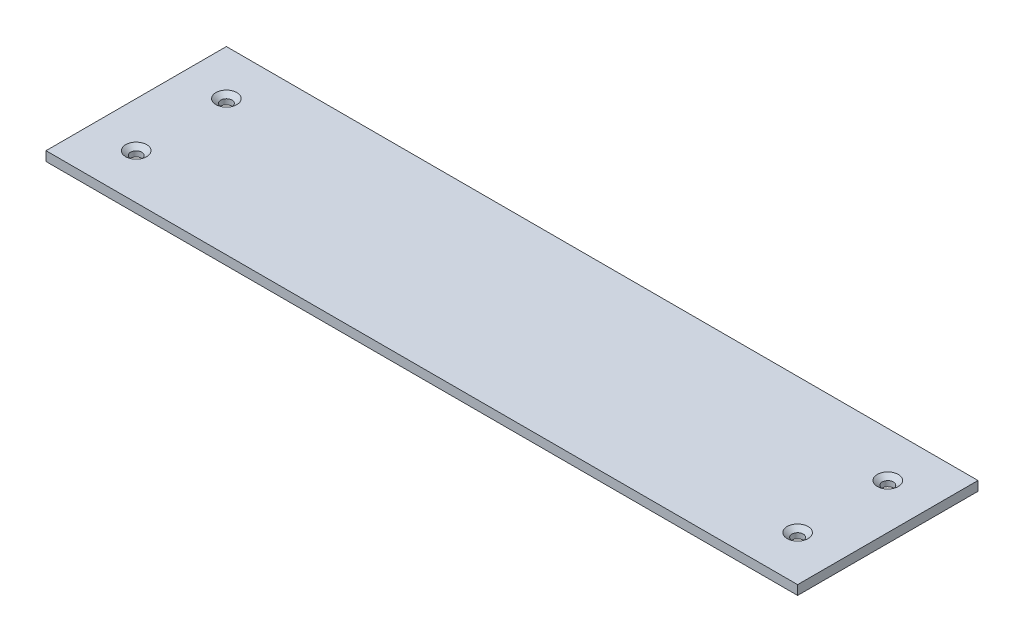
ISO-10303-21;
HEADER;
FILE_DESCRIPTION(('STEP AP214'),'2;1');
FILE_NAME('part.step','',(''),(''),'','','');
FILE_SCHEMA(('AUTOMOTIVE_DESIGN { 1 0 10303 214 1 1 1 1 }'));
ENDSEC;
DATA;
#1=APPLICATION_CONTEXT('core data for automotive mechanical design processes');
#2=APPLICATION_PROTOCOL_DEFINITION('international standard','automotive_design',2000,#1);
#3=PRODUCT_CONTEXT('',#1,'mechanical');
#4=PRODUCT('Part','Part','',(#3));
#5=PRODUCT_RELATED_PRODUCT_CATEGORY('part','',(#4));
#6=PRODUCT_DEFINITION_FORMATION('','',#4);
#7=PRODUCT_DEFINITION_CONTEXT('part definition',#1,'design');
#8=PRODUCT_DEFINITION('design','',#6,#7);
#9=PRODUCT_DEFINITION_SHAPE('','',#8);
#10=(LENGTH_UNIT() NAMED_UNIT(*) SI_UNIT(.MILLI.,.METRE.));
#11=(NAMED_UNIT(*) PLANE_ANGLE_UNIT() SI_UNIT($,.RADIAN.));
#12=(NAMED_UNIT(*) SI_UNIT($,.STERADIAN.) SOLID_ANGLE_UNIT());
#13=UNCERTAINTY_MEASURE_WITH_UNIT(LENGTH_MEASURE(1.E-05),#10,'distance_accuracy_value','');
#14=(GEOMETRIC_REPRESENTATION_CONTEXT(3) GLOBAL_UNCERTAINTY_ASSIGNED_CONTEXT((#13)) GLOBAL_UNIT_ASSIGNED_CONTEXT((#10,
#11,#12)) REPRESENTATION_CONTEXT('',''));
#15=CARTESIAN_POINT('',(0.,0.,0.));
#16=DIRECTION('',(0.,0.,1.));
#17=DIRECTION('',(1.,0.,0.));
#18=AXIS2_PLACEMENT_3D('',#15,#16,#17);
#19=CARTESIAN_POINT('',(0.,3.175,0.));
#20=DIRECTION('',(1.,0.,0.));
#21=DIRECTION('',(0.,0.,-1.));
#22=AXIS2_PLACEMENT_3D('',#19,#20,#21);
#23=PLANE('',#22);
#24=DIRECTION('',(0.,0.,1.));
#25=VECTOR('',#24,1.);
#26=CARTESIAN_POINT('',(0.,0.,0.));
#27=LINE('',#26,#25);
#28=CARTESIAN_POINT('',(0.,0.,-60.96));
#29=VERTEX_POINT('',#28);
#30=CARTESIAN_POINT('',(0.,0.,0.));
#31=VERTEX_POINT('',#30);
#32=EDGE_CURVE('E111',#29,#31,#27,.T.);
#33=ORIENTED_EDGE('',*,*,#32,.T.);
#34=DIRECTION('',(0.,-1.,0.));
#35=VECTOR('',#34,1.);
#36=CARTESIAN_POINT('',(0.,3.175,0.));
#37=LINE('',#36,#35);
#38=CARTESIAN_POINT('',(0.,3.175,0.));
#39=VERTEX_POINT('',#38);
#40=EDGE_CURVE('E11',#39,#31,#37,.T.);
#41=ORIENTED_EDGE('',*,*,#40,.F.);
#42=DIRECTION('',(0.,0.,1.));
#43=VECTOR('',#42,1.);
#44=CARTESIAN_POINT('',(0.,3.175,0.));
#45=LINE('',#44,#43);
#46=CARTESIAN_POINT('',(0.,3.175,-60.96));
#47=VERTEX_POINT('',#46);
#48=EDGE_CURVE('E95',#47,#39,#45,.T.);
#49=ORIENTED_EDGE('',*,*,#48,.F.);
#50=DIRECTION('',(0.,-1.,0.));
#51=VECTOR('',#50,1.);
#52=CARTESIAN_POINT('',(0.,3.175,-60.96));
#53=LINE('',#52,#51);
#54=EDGE_CURVE('E107',#47,#29,#53,.T.);
#55=ORIENTED_EDGE('',*,*,#54,.T.);
#56=EDGE_LOOP('',(#33,#41,#49,#55));
#57=FACE_BOUND('',#56,.T.);
#58=ADVANCED_FACE('F43',(#57),#23,.F.);
#59=CARTESIAN_POINT('',(0.,3.175,0.));
#60=DIRECTION('',(0.,0.,-1.));
#61=DIRECTION('',(-1.,0.,0.));
#62=AXIS2_PLACEMENT_3D('',#59,#60,#61);
#63=PLANE('',#62);
#64=DIRECTION('',(1.,0.,0.));
#65=VECTOR('',#64,1.);
#66=CARTESIAN_POINT('',(0.,0.,0.));
#67=LINE('',#66,#65);
#68=CARTESIAN_POINT('',(254.,0.,0.));
#69=VERTEX_POINT('',#68);
#70=EDGE_CURVE('E100',#31,#69,#67,.T.);
#71=ORIENTED_EDGE('',*,*,#70,.T.);
#72=DIRECTION('',(0.,-1.,0.));
#73=VECTOR('',#72,1.);
#74=CARTESIAN_POINT('',(254.,3.175,0.));
#75=LINE('',#74,#73);
#76=CARTESIAN_POINT('',(254.,3.175,0.));
#77=VERTEX_POINT('',#76);
#78=EDGE_CURVE('E52',#77,#69,#75,.T.);
#79=ORIENTED_EDGE('',*,*,#78,.F.);
#80=DIRECTION('',(1.,0.,0.));
#81=VECTOR('',#80,1.);
#82=CARTESIAN_POINT('',(0.,3.175,0.));
#83=LINE('',#82,#81);
#84=EDGE_CURVE('E90',#39,#77,#83,.T.);
#85=ORIENTED_EDGE('',*,*,#84,.F.);
#86=ORIENTED_EDGE('',*,*,#40,.T.);
#87=EDGE_LOOP('',(#71,#79,#85,#86));
#88=FACE_BOUND('',#87,.T.);
#89=ADVANCED_FACE('F99',(#88),#63,.F.);
#90=CARTESIAN_POINT('',(254.,3.175,0.));
#91=DIRECTION('',(-1.,0.,0.));
#92=DIRECTION('',(0.,0.,1.));
#93=AXIS2_PLACEMENT_3D('',#90,#91,#92);
#94=PLANE('',#93);
#95=DIRECTION('',(0.,0.,-1.));
#96=VECTOR('',#95,1.);
#97=CARTESIAN_POINT('',(254.,0.,0.));
#98=LINE('',#97,#96);
#99=CARTESIAN_POINT('',(254.,0.,-60.96));
#100=VERTEX_POINT('',#99);
#101=EDGE_CURVE('E77',#69,#100,#98,.T.);
#102=ORIENTED_EDGE('',*,*,#101,.T.);
#103=DIRECTION('',(0.,-1.,0.));
#104=VECTOR('',#103,1.);
#105=CARTESIAN_POINT('',(254.,3.175,-60.96));
#106=LINE('',#105,#104);
#107=CARTESIAN_POINT('',(254.,3.175,-60.96));
#108=VERTEX_POINT('',#107);
#109=EDGE_CURVE('E102',#108,#100,#106,.T.);
#110=ORIENTED_EDGE('',*,*,#109,.F.);
#111=DIRECTION('',(0.,0.,-1.));
#112=VECTOR('',#111,1.);
#113=CARTESIAN_POINT('',(254.,3.175,0.));
#114=LINE('',#113,#112);
#115=EDGE_CURVE('E93',#77,#108,#114,.T.);
#116=ORIENTED_EDGE('',*,*,#115,.F.);
#117=ORIENTED_EDGE('',*,*,#78,.T.);
#118=EDGE_LOOP('',(#102,#110,#116,#117));
#119=FACE_BOUND('',#118,.T.);
#120=ADVANCED_FACE('F103',(#119),#94,.F.);
#121=CARTESIAN_POINT('',(0.,3.175,-60.96));
#122=DIRECTION('',(0.,0.,1.));
#123=DIRECTION('',(1.,0.,0.));
#124=AXIS2_PLACEMENT_3D('',#121,#122,#123);
#125=PLANE('',#124);
#126=DIRECTION('',(-1.,0.,0.));
#127=VECTOR('',#126,1.);
#128=CARTESIAN_POINT('',(0.,0.,-60.96));
#129=LINE('',#128,#127);
#130=EDGE_CURVE('E83',#100,#29,#129,.T.);
#131=ORIENTED_EDGE('',*,*,#130,.T.);
#132=ORIENTED_EDGE('',*,*,#54,.F.);
#133=DIRECTION('',(-1.,0.,0.));
#134=VECTOR('',#133,1.);
#135=CARTESIAN_POINT('',(0.,3.175,-60.96));
#136=LINE('',#135,#134);
#137=EDGE_CURVE('E60',#108,#47,#136,.T.);
#138=ORIENTED_EDGE('',*,*,#137,.F.);
#139=ORIENTED_EDGE('',*,*,#109,.T.);
#140=EDGE_LOOP('',(#131,#132,#138,#139));
#141=FACE_BOUND('',#140,.T.);
#142=ADVANCED_FACE('F125',(#141),#125,.F.);
#143=CARTESIAN_POINT('',(0.,3.175,0.));
#144=DIRECTION('',(0.,-1.,0.));
#145=DIRECTION('',(0.,0.,-1.));
#146=AXIS2_PLACEMENT_3D('',#143,#144,#145);
#147=PLANE('',#146);
#148=CARTESIAN_POINT('',(15.24,3.175,-15.24));
#149=DIRECTION('',(0.,1.,0.));
#150=DIRECTION('',(0.,0.,1.));
#151=AXIS2_PLACEMENT_3D('',#148,#149,#150);
#152=CIRCLE('',#151,3.5433);
#153=CARTESIAN_POINT('',(15.24,3.175,-11.6967));
#154=VERTEX_POINT('',#153);
#155=EDGE_CURVE('E175',#154,#154,#152,.T.);
#156=ORIENTED_EDGE('',*,*,#155,.F.);
#157=EDGE_LOOP('',(#156));
#158=FACE_BOUND('',#157,.T.);
#159=CARTESIAN_POINT('',(15.24,3.175,-45.72));
#160=DIRECTION('',(0.,1.,0.));
#161=DIRECTION('',(0.,0.,1.));
#162=AXIS2_PLACEMENT_3D('',#159,#160,#161);
#163=CIRCLE('',#162,3.5433);
#164=CARTESIAN_POINT('',(15.24,3.175,-42.1767));
#165=VERTEX_POINT('',#164);
#166=EDGE_CURVE('E163',#165,#165,#163,.T.);
#167=ORIENTED_EDGE('',*,*,#166,.F.);
#168=EDGE_LOOP('',(#167));
#169=FACE_BOUND('',#168,.T.);
#170=CARTESIAN_POINT('',(238.76,3.175,-15.24));
#171=DIRECTION('',(0.,1.,0.));
#172=DIRECTION('',(0.,0.,1.));
#173=AXIS2_PLACEMENT_3D('',#170,#171,#172);
#174=CIRCLE('',#173,3.5433);
#175=CARTESIAN_POINT('',(238.76,3.175,-11.6967));
#176=VERTEX_POINT('',#175);
#177=EDGE_CURVE('E151',#176,#176,#174,.T.);
#178=ORIENTED_EDGE('',*,*,#177,.F.);
#179=EDGE_LOOP('',(#178));
#180=FACE_BOUND('',#179,.T.);
#181=CARTESIAN_POINT('',(238.76,3.175,-45.72));
#182=DIRECTION('',(0.,1.,0.));
#183=DIRECTION('',(0.,0.,1.));
#184=AXIS2_PLACEMENT_3D('',#181,#182,#183);
#185=CIRCLE('',#184,3.5433);
#186=CARTESIAN_POINT('',(238.76,3.175,-42.1767));
#187=VERTEX_POINT('',#186);
#188=EDGE_CURVE('E139',#187,#187,#185,.T.);
#189=ORIENTED_EDGE('',*,*,#188,.F.);
#190=EDGE_LOOP('',(#189));
#191=FACE_BOUND('',#190,.T.);
#192=ORIENTED_EDGE('',*,*,#48,.T.);
#193=ORIENTED_EDGE('',*,*,#84,.T.);
#194=ORIENTED_EDGE('',*,*,#115,.T.);
#195=ORIENTED_EDGE('',*,*,#137,.T.);
#196=EDGE_LOOP('',(#192,#193,#194,#195));
#197=FACE_BOUND('',#196,.T.);
#198=ADVANCED_FACE('F91',(#158,#169,#180,#191,#197),#147,.F.);
#199=CARTESIAN_POINT('',(0.,0.,0.));
#200=DIRECTION('',(0.,-1.,0.));
#201=DIRECTION('',(0.,0.,-1.));
#202=AXIS2_PLACEMENT_3D('',#199,#200,#201);
#203=PLANE('',#202);
#204=CARTESIAN_POINT('',(15.24,0.,-15.24));
#205=DIRECTION('',(0.,1.,0.));
#206=DIRECTION('',(0.,0.,1.));
#207=AXIS2_PLACEMENT_3D('',#204,#205,#206);
#208=CIRCLE('',#207,1.89865);
#209=CARTESIAN_POINT('',(15.24,0.,-13.34135));
#210=VERTEX_POINT('',#209);
#211=EDGE_CURVE('E167',#210,#210,#208,.T.);
#212=ORIENTED_EDGE('',*,*,#211,.T.);
#213=EDGE_LOOP('',(#212));
#214=FACE_BOUND('',#213,.T.);
#215=CARTESIAN_POINT('',(15.24,0.,-45.72));
#216=DIRECTION('',(0.,1.,0.));
#217=DIRECTION('',(0.,0.,1.));
#218=AXIS2_PLACEMENT_3D('',#215,#216,#217);
#219=CIRCLE('',#218,1.89865);
#220=CARTESIAN_POINT('',(15.24,0.,-43.82135));
#221=VERTEX_POINT('',#220);
#222=EDGE_CURVE('E155',#221,#221,#219,.T.);
#223=ORIENTED_EDGE('',*,*,#222,.T.);
#224=EDGE_LOOP('',(#223));
#225=FACE_BOUND('',#224,.T.);
#226=CARTESIAN_POINT('',(238.76,0.,-15.24));
#227=DIRECTION('',(0.,1.,0.));
#228=DIRECTION('',(0.,0.,1.));
#229=AXIS2_PLACEMENT_3D('',#226,#227,#228);
#230=CIRCLE('',#229,1.89865);
#231=CARTESIAN_POINT('',(238.76,0.,-13.34135));
#232=VERTEX_POINT('',#231);
#233=EDGE_CURVE('E143',#232,#232,#230,.T.);
#234=ORIENTED_EDGE('',*,*,#233,.T.);
#235=EDGE_LOOP('',(#234));
#236=FACE_BOUND('',#235,.T.);
#237=CARTESIAN_POINT('',(238.76,0.,-45.72));
#238=DIRECTION('',(0.,1.,0.));
#239=DIRECTION('',(0.,0.,1.));
#240=AXIS2_PLACEMENT_3D('',#237,#238,#239);
#241=CIRCLE('',#240,1.89865);
#242=CARTESIAN_POINT('',(238.76,0.,-43.82135));
#243=VERTEX_POINT('',#242);
#244=EDGE_CURVE('E115',#243,#243,#241,.T.);
#245=ORIENTED_EDGE('',*,*,#244,.T.);
#246=EDGE_LOOP('',(#245));
#247=FACE_BOUND('',#246,.T.);
#248=ORIENTED_EDGE('',*,*,#32,.F.);
#249=ORIENTED_EDGE('',*,*,#130,.F.);
#250=ORIENTED_EDGE('',*,*,#101,.F.);
#251=ORIENTED_EDGE('',*,*,#70,.F.);
#252=EDGE_LOOP('',(#248,#249,#250,#251));
#253=FACE_BOUND('',#252,.T.);
#254=ADVANCED_FACE('F128',(#214,#225,#236,#247,#253),#203,.T.);
#255=CARTESIAN_POINT('',(238.76,3.175,-45.72));
#256=DIRECTION('',(0.,1.,0.));
#257=DIRECTION('',(0.,0.,1.));
#258=AXIS2_PLACEMENT_3D('',#255,#256,#257);
#259=CYLINDRICAL_SURFACE('',#258,1.89865);
#260=ORIENTED_EDGE('',*,*,#244,.F.);
#261=EDGE_LOOP('',(#260));
#262=FACE_BOUND('',#261,.T.);
#263=CARTESIAN_POINT('',(238.76,1.79497479158429,-45.72));
#264=DIRECTION('',(0.,1.,0.));
#265=DIRECTION('',(0.,0.,1.));
#266=AXIS2_PLACEMENT_3D('',#263,#264,#265);
#267=CIRCLE('',#266,1.89865);
#268=CARTESIAN_POINT('',(238.76,1.79497479158429,-43.82135));
#269=VERTEX_POINT('',#268);
#270=EDGE_CURVE('E135',#269,#269,#267,.T.);
#271=ORIENTED_EDGE('',*,*,#270,.T.);
#272=EDGE_LOOP('',(#271));
#273=FACE_BOUND('',#272,.T.);
#274=ADVANCED_FACE('F194',(#262,#273),#259,.F.);
#275=CARTESIAN_POINT('',(238.76,3.175,-45.72));
#276=DIRECTION('',(0.,1.,0.));
#277=DIRECTION('',(0.,0.,1.));
#278=AXIS2_PLACEMENT_3D('',#275,#276,#277);
#279=CONICAL_SURFACE('',#278,3.5433,0.872664625997164);
#280=ORIENTED_EDGE('',*,*,#270,.F.);
#281=EDGE_LOOP('',(#280));
#282=FACE_BOUND('',#281,.T.);
#283=ORIENTED_EDGE('',*,*,#188,.T.);
#284=EDGE_LOOP('',(#283));
#285=FACE_BOUND('',#284,.T.);
#286=ADVANCED_FACE('F191',(#282,#285),#279,.F.);
#287=CARTESIAN_POINT('',(238.76,3.175,-15.24));
#288=DIRECTION('',(0.,1.,0.));
#289=DIRECTION('',(0.,0.,1.));
#290=AXIS2_PLACEMENT_3D('',#287,#288,#289);
#291=CYLINDRICAL_SURFACE('',#290,1.89865);
#292=ORIENTED_EDGE('',*,*,#233,.F.);
#293=EDGE_LOOP('',(#292));
#294=FACE_BOUND('',#293,.T.);
#295=CARTESIAN_POINT('',(238.76,1.79497479158429,-15.24));
#296=DIRECTION('',(0.,1.,0.));
#297=DIRECTION('',(0.,0.,1.));
#298=AXIS2_PLACEMENT_3D('',#295,#296,#297);
#299=CIRCLE('',#298,1.89865);
#300=CARTESIAN_POINT('',(238.76,1.79497479158429,-13.34135));
#301=VERTEX_POINT('',#300);
#302=EDGE_CURVE('E147',#301,#301,#299,.T.);
#303=ORIENTED_EDGE('',*,*,#302,.T.);
#304=EDGE_LOOP('',(#303));
#305=FACE_BOUND('',#304,.T.);
#306=ADVANCED_FACE('F193',(#294,#305),#291,.F.);
#307=CARTESIAN_POINT('',(238.76,3.175,-15.24));
#308=DIRECTION('',(0.,1.,0.));
#309=DIRECTION('',(0.,0.,1.));
#310=AXIS2_PLACEMENT_3D('',#307,#308,#309);
#311=CONICAL_SURFACE('',#310,3.5433,0.872664625997164);
#312=ORIENTED_EDGE('',*,*,#302,.F.);
#313=EDGE_LOOP('',(#312));
#314=FACE_BOUND('',#313,.T.);
#315=ORIENTED_EDGE('',*,*,#177,.T.);
#316=EDGE_LOOP('',(#315));
#317=FACE_BOUND('',#316,.T.);
#318=ADVANCED_FACE('F201',(#314,#317),#311,.F.);
#319=CARTESIAN_POINT('',(15.24,3.175,-45.72));
#320=DIRECTION('',(0.,1.,0.));
#321=DIRECTION('',(0.,0.,1.));
#322=AXIS2_PLACEMENT_3D('',#319,#320,#321);
#323=CYLINDRICAL_SURFACE('',#322,1.89865);
#324=ORIENTED_EDGE('',*,*,#222,.F.);
#325=EDGE_LOOP('',(#324));
#326=FACE_BOUND('',#325,.T.);
#327=CARTESIAN_POINT('',(15.24,1.79497479158429,-45.72));
#328=DIRECTION('',(0.,1.,0.));
#329=DIRECTION('',(0.,0.,1.));
#330=AXIS2_PLACEMENT_3D('',#327,#328,#329);
#331=CIRCLE('',#330,1.89865);
#332=CARTESIAN_POINT('',(15.24,1.79497479158429,-43.82135));
#333=VERTEX_POINT('',#332);
#334=EDGE_CURVE('E159',#333,#333,#331,.T.);
#335=ORIENTED_EDGE('',*,*,#334,.T.);
#336=EDGE_LOOP('',(#335));
#337=FACE_BOUND('',#336,.T.);
#338=ADVANCED_FACE('F235',(#326,#337),#323,.F.);
#339=CARTESIAN_POINT('',(15.24,3.175,-45.72));
#340=DIRECTION('',(0.,1.,0.));
#341=DIRECTION('',(0.,0.,1.));
#342=AXIS2_PLACEMENT_3D('',#339,#340,#341);
#343=CONICAL_SURFACE('',#342,3.5433,0.872664625997165);
#344=ORIENTED_EDGE('',*,*,#334,.F.);
#345=EDGE_LOOP('',(#344));
#346=FACE_BOUND('',#345,.T.);
#347=ORIENTED_EDGE('',*,*,#166,.T.);
#348=EDGE_LOOP('',(#347));
#349=FACE_BOUND('',#348,.T.);
#350=ADVANCED_FACE('F240',(#346,#349),#343,.F.);
#351=CARTESIAN_POINT('',(15.24,3.175,-15.24));
#352=DIRECTION('',(0.,1.,0.));
#353=DIRECTION('',(0.,0.,1.));
#354=AXIS2_PLACEMENT_3D('',#351,#352,#353);
#355=CYLINDRICAL_SURFACE('',#354,1.89865);
#356=ORIENTED_EDGE('',*,*,#211,.F.);
#357=EDGE_LOOP('',(#356));
#358=FACE_BOUND('',#357,.T.);
#359=CARTESIAN_POINT('',(15.24,1.79497479158429,-15.24));
#360=DIRECTION('',(0.,1.,0.));
#361=DIRECTION('',(0.,0.,1.));
#362=AXIS2_PLACEMENT_3D('',#359,#360,#361);
#363=CIRCLE('',#362,1.89865);
#364=CARTESIAN_POINT('',(15.24,1.79497479158429,-13.34135));
#365=VERTEX_POINT('',#364);
#366=EDGE_CURVE('E171',#365,#365,#363,.T.);
#367=ORIENTED_EDGE('',*,*,#366,.T.);
#368=EDGE_LOOP('',(#367));
#369=FACE_BOUND('',#368,.T.);
#370=ADVANCED_FACE('F246',(#358,#369),#355,.F.);
#371=CARTESIAN_POINT('',(15.24,3.175,-15.24));
#372=DIRECTION('',(0.,1.,0.));
#373=DIRECTION('',(0.,0.,1.));
#374=AXIS2_PLACEMENT_3D('',#371,#372,#373);
#375=CONICAL_SURFACE('',#374,3.5433,0.872664625997165);
#376=ORIENTED_EDGE('',*,*,#366,.F.);
#377=EDGE_LOOP('',(#376));
#378=FACE_BOUND('',#377,.T.);
#379=ORIENTED_EDGE('',*,*,#155,.T.);
#380=EDGE_LOOP('',(#379));
#381=FACE_BOUND('',#380,.T.);
#382=ADVANCED_FACE('F180',(#378,#381),#375,.F.);
#383=CLOSED_SHELL('',(#58,#89,#120,#142,#198,#254,#274,#286,#306,#318,#338,#350,#370,#382));
#384=MANIFOLD_SOLID_BREP('B2',#383);
#385=ADVANCED_BREP_SHAPE_REPRESENTATION('',(#18,#384),#14);
#386=SHAPE_DEFINITION_REPRESENTATION(#9,#385);
ENDSEC;
END-ISO-10303-21;
